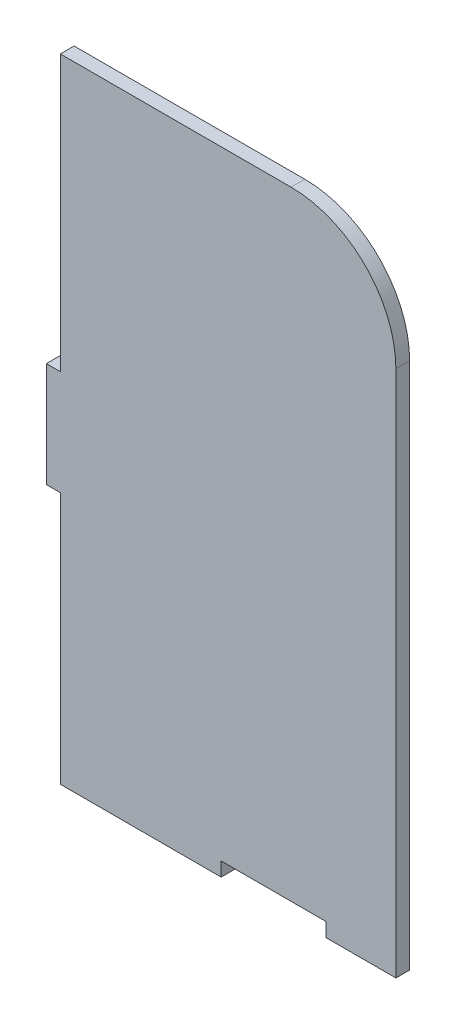
ISO-10303-21;
HEADER;
FILE_DESCRIPTION(('STEP AP214'),'2;1');
FILE_NAME('part.step','',(''),(''),'','','');
FILE_SCHEMA(('AUTOMOTIVE_DESIGN { 1 0 10303 214 1 1 1 1 }'));
ENDSEC;
DATA;
#1=APPLICATION_CONTEXT('core data for automotive mechanical design processes');
#2=APPLICATION_PROTOCOL_DEFINITION('international standard','automotive_design',2000,#1);
#3=PRODUCT_CONTEXT('',#1,'mechanical');
#4=PRODUCT('Part','Part','',(#3));
#5=PRODUCT_RELATED_PRODUCT_CATEGORY('part','',(#4));
#6=PRODUCT_DEFINITION_FORMATION('','',#4);
#7=PRODUCT_DEFINITION_CONTEXT('part definition',#1,'design');
#8=PRODUCT_DEFINITION('design','',#6,#7);
#9=PRODUCT_DEFINITION_SHAPE('','',#8);
#10=(LENGTH_UNIT() NAMED_UNIT(*) SI_UNIT(.MILLI.,.METRE.));
#11=(NAMED_UNIT(*) PLANE_ANGLE_UNIT() SI_UNIT($,.RADIAN.));
#12=(NAMED_UNIT(*) SI_UNIT($,.STERADIAN.) SOLID_ANGLE_UNIT());
#13=UNCERTAINTY_MEASURE_WITH_UNIT(LENGTH_MEASURE(1.E-05),#10,'distance_accuracy_value','');
#14=(GEOMETRIC_REPRESENTATION_CONTEXT(3) GLOBAL_UNCERTAINTY_ASSIGNED_CONTEXT((#13)) GLOBAL_UNIT_ASSIGNED_CONTEXT((#10,
#11,#12)) REPRESENTATION_CONTEXT('',''));
#15=CARTESIAN_POINT('',(0.,0.,0.));
#16=DIRECTION('',(0.,0.,1.));
#17=DIRECTION('',(1.,0.,0.));
#18=AXIS2_PLACEMENT_3D('',#15,#16,#17);
#19=CARTESIAN_POINT('',(215.829586762206,-10.1600000000001,-10.));
#20=DIRECTION('',(-1.,0.,0.));
#21=DIRECTION('',(0.,0.,1.));
#22=AXIS2_PLACEMENT_3D('',#19,#20,#21);
#23=PLANE('',#22);
#24=DIRECTION('',(0.,-1.,0.));
#25=VECTOR('',#24,1.);
#26=CARTESIAN_POINT('',(215.829586762206,-10.1600000000001,0.));
#27=LINE('',#26,#25);
#28=CARTESIAN_POINT('',(215.829586762206,-10.1600000000001,0.));
#29=VERTEX_POINT('',#28);
#30=CARTESIAN_POINT('',(215.829586762206,-210.16,0.));
#31=VERTEX_POINT('',#30);
#32=EDGE_CURVE('E163',#29,#31,#27,.T.);
#33=ORIENTED_EDGE('',*,*,#32,.F.);
#34=DIRECTION('',(0.,0.,1.));
#35=VECTOR('',#34,1.);
#36=CARTESIAN_POINT('',(215.829586762206,-10.1600000000001,-10.));
#37=LINE('',#36,#35);
#38=CARTESIAN_POINT('',(215.829586762206,-10.1600000000001,-10.));
#39=VERTEX_POINT('',#38);
#40=EDGE_CURVE('E11',#39,#29,#37,.T.);
#41=ORIENTED_EDGE('',*,*,#40,.F.);
#42=DIRECTION('',(0.,-1.,0.));
#43=VECTOR('',#42,1.);
#44=CARTESIAN_POINT('',(215.829586762206,-10.1600000000001,-10.));
#45=LINE('',#44,#43);
#46=CARTESIAN_POINT('',(215.829586762206,-210.16,-10.));
#47=VERTEX_POINT('',#46);
#48=EDGE_CURVE('E198',#39,#47,#45,.T.);
#49=ORIENTED_EDGE('',*,*,#48,.T.);
#50=DIRECTION('',(0.,0.,1.));
#51=VECTOR('',#50,1.);
#52=CARTESIAN_POINT('',(215.829586762206,-210.16,-10.));
#53=LINE('',#52,#51);
#54=EDGE_CURVE('E39',#47,#31,#53,.T.);
#55=ORIENTED_EDGE('',*,*,#54,.T.);
#56=EDGE_LOOP('',(#33,#41,#49,#55));
#57=FACE_BOUND('',#56,.T.);
#58=ADVANCED_FACE('F36',(#57),#23,.T.);
#59=CARTESIAN_POINT('',(215.829586762206,-10.1600000000001,-10.));
#60=DIRECTION('',(0.,1.,0.));
#61=DIRECTION('',(0.,0.,1.));
#62=AXIS2_PLACEMENT_3D('',#59,#60,#61);
#63=PLANE('',#62);
#64=DIRECTION('',(-1.,0.,0.));
#65=VECTOR('',#64,1.);
#66=CARTESIAN_POINT('',(215.829586762206,-10.1600000000001,0.));
#67=LINE('',#66,#65);
#68=CARTESIAN_POINT('',(383.521789204401,-10.1600000000001,0.));
#69=VERTEX_POINT('',#68);
#70=EDGE_CURVE('E196',#69,#29,#67,.T.);
#71=ORIENTED_EDGE('',*,*,#70,.F.);
#72=DIRECTION('',(0.,0.,1.));
#73=VECTOR('',#72,1.);
#74=CARTESIAN_POINT('',(383.521789204401,-10.1600000000001,-10.));
#75=LINE('',#74,#73);
#76=CARTESIAN_POINT('',(383.521789204401,-10.1600000000001,-10.));
#77=VERTEX_POINT('',#76);
#78=EDGE_CURVE('E45',#77,#69,#75,.T.);
#79=ORIENTED_EDGE('',*,*,#78,.F.);
#80=DIRECTION('',(-1.,0.,0.));
#81=VECTOR('',#80,1.);
#82=CARTESIAN_POINT('',(215.829586762206,-10.1600000000001,-10.));
#83=LINE('',#82,#81);
#84=EDGE_CURVE('E153',#77,#39,#83,.T.);
#85=ORIENTED_EDGE('',*,*,#84,.T.);
#86=ORIENTED_EDGE('',*,*,#40,.T.);
#87=EDGE_LOOP('',(#71,#79,#85,#86));
#88=FACE_BOUND('',#87,.T.);
#89=ADVANCED_FACE('F220',(#88),#63,.T.);
#90=CARTESIAN_POINT('',(383.521789204401,-86.3600000000001,-10.));
#91=DIRECTION('',(0.,0.,1.));
#92=DIRECTION('',(1.,0.,0.));
#93=AXIS2_PLACEMENT_3D('',#90,#91,#92);
#94=CYLINDRICAL_SURFACE('',#93,76.2);
#95=CARTESIAN_POINT('',(383.521789204401,-86.3600000000001,0.));
#96=DIRECTION('',(0.,0.,1.));
#97=DIRECTION('',(1.,0.,0.));
#98=AXIS2_PLACEMENT_3D('',#95,#96,#97);
#99=CIRCLE('',#98,76.2);
#100=CARTESIAN_POINT('',(459.721789204401,-86.3600000000001,0.));
#101=VERTEX_POINT('',#100);
#102=EDGE_CURVE('E140',#101,#69,#99,.T.);
#103=ORIENTED_EDGE('',*,*,#102,.F.);
#104=DIRECTION('',(0.,0.,1.));
#105=VECTOR('',#104,1.);
#106=CARTESIAN_POINT('',(459.721789204401,-86.3600000000001,-10.));
#107=LINE('',#106,#105);
#108=CARTESIAN_POINT('',(459.721789204401,-86.3600000000001,-10.));
#109=VERTEX_POINT('',#108);
#110=EDGE_CURVE('E135',#109,#101,#107,.T.);
#111=ORIENTED_EDGE('',*,*,#110,.F.);
#112=CARTESIAN_POINT('',(383.521789204401,-86.3600000000001,-10.));
#113=DIRECTION('',(0.,0.,1.));
#114=DIRECTION('',(1.,0.,0.));
#115=AXIS2_PLACEMENT_3D('',#112,#113,#114);
#116=CIRCLE('',#115,76.2);
#117=EDGE_CURVE('E138',#109,#77,#116,.T.);
#118=ORIENTED_EDGE('',*,*,#117,.T.);
#119=ORIENTED_EDGE('',*,*,#78,.T.);
#120=EDGE_LOOP('',(#103,#111,#118,#119));
#121=FACE_BOUND('',#120,.T.);
#122=ADVANCED_FACE('F137',(#121),#94,.T.);
#123=CARTESIAN_POINT('',(459.721789204401,-86.3600000000001,-10.));
#124=DIRECTION('',(1.,0.,0.));
#125=DIRECTION('',(0.,1.,0.));
#126=AXIS2_PLACEMENT_3D('',#123,#124,#125);
#127=PLANE('',#126);
#128=DIRECTION('',(0.,1.,0.));
#129=VECTOR('',#128,1.);
#130=CARTESIAN_POINT('',(459.721789204401,-86.3600000000001,0.));
#131=LINE('',#130,#129);
#132=CARTESIAN_POINT('',(459.721789204401,-469.9,0.));
#133=VERTEX_POINT('',#132);
#134=EDGE_CURVE('E193',#133,#101,#131,.T.);
#135=ORIENTED_EDGE('',*,*,#134,.F.);
#136=DIRECTION('',(0.,0.,1.));
#137=VECTOR('',#136,1.);
#138=CARTESIAN_POINT('',(459.721789204401,-469.9,-10.));
#139=LINE('',#138,#137);
#140=CARTESIAN_POINT('',(459.721789204401,-469.9,-10.));
#141=VERTEX_POINT('',#140);
#142=EDGE_CURVE('E145',#141,#133,#139,.T.);
#143=ORIENTED_EDGE('',*,*,#142,.F.);
#144=DIRECTION('',(0.,1.,0.));
#145=VECTOR('',#144,1.);
#146=CARTESIAN_POINT('',(459.721789204401,-86.3600000000001,-10.));
#147=LINE('',#146,#145);
#148=EDGE_CURVE('E151',#141,#109,#147,.T.);
#149=ORIENTED_EDGE('',*,*,#148,.T.);
#150=ORIENTED_EDGE('',*,*,#110,.T.);
#151=EDGE_LOOP('',(#135,#143,#149,#150));
#152=FACE_BOUND('',#151,.T.);
#153=ADVANCED_FACE('F155',(#152),#127,.T.);
#154=CARTESIAN_POINT('',(408.9217892044,-469.9,-10.));
#155=DIRECTION('',(0.,-1.,0.));
#156=DIRECTION('',(0.,0.,-1.));
#157=AXIS2_PLACEMENT_3D('',#154,#155,#156);
#158=PLANE('',#157);
#159=DIRECTION('',(1.,0.,0.));
#160=VECTOR('',#159,1.);
#161=CARTESIAN_POINT('',(408.9217892044,-469.9,0.));
#162=LINE('',#161,#160);
#163=CARTESIAN_POINT('',(408.9217892044,-469.9,0.));
#164=VERTEX_POINT('',#163);
#165=EDGE_CURVE('E190',#164,#133,#162,.T.);
#166=ORIENTED_EDGE('',*,*,#165,.F.);
#167=DIRECTION('',(0.,0.,1.));
#168=VECTOR('',#167,1.);
#169=CARTESIAN_POINT('',(408.9217892044,-469.9,-10.));
#170=LINE('',#169,#168);
#171=CARTESIAN_POINT('',(408.9217892044,-469.9,-10.));
#172=VERTEX_POINT('',#171);
#173=EDGE_CURVE('E202',#172,#164,#170,.T.);
#174=ORIENTED_EDGE('',*,*,#173,.F.);
#175=DIRECTION('',(1.,0.,0.));
#176=VECTOR('',#175,1.);
#177=CARTESIAN_POINT('',(408.9217892044,-469.9,-10.));
#178=LINE('',#177,#176);
#179=EDGE_CURVE('E156',#172,#141,#178,.T.);
#180=ORIENTED_EDGE('',*,*,#179,.T.);
#181=ORIENTED_EDGE('',*,*,#142,.T.);
#182=EDGE_LOOP('',(#166,#174,#180,#181));
#183=FACE_BOUND('',#182,.T.);
#184=ADVANCED_FACE('F233',(#183),#158,.T.);
#185=CARTESIAN_POINT('',(408.9217892044,-469.9,-10.));
#186=DIRECTION('',(-1.,0.,0.));
#187=DIRECTION('',(0.,0.,1.));
#188=AXIS2_PLACEMENT_3D('',#185,#186,#187);
#189=PLANE('',#188);
#190=DIRECTION('',(0.,-1.,0.));
#191=VECTOR('',#190,1.);
#192=CARTESIAN_POINT('',(408.9217892044,-469.9,0.));
#193=LINE('',#192,#191);
#194=CARTESIAN_POINT('',(408.9217892044,-459.739999999998,0.));
#195=VERTEX_POINT('',#194);
#196=EDGE_CURVE('E187',#195,#164,#193,.T.);
#197=ORIENTED_EDGE('',*,*,#196,.F.);
#198=DIRECTION('',(0.,0.,1.));
#199=VECTOR('',#198,1.);
#200=CARTESIAN_POINT('',(408.9217892044,-459.739999999998,-10.));
#201=LINE('',#200,#199);
#202=CARTESIAN_POINT('',(408.9217892044,-459.739999999998,-10.));
#203=VERTEX_POINT('',#202);
#204=EDGE_CURVE('E204',#203,#195,#201,.T.);
#205=ORIENTED_EDGE('',*,*,#204,.F.);
#206=DIRECTION('',(0.,-1.,0.));
#207=VECTOR('',#206,1.);
#208=CARTESIAN_POINT('',(408.9217892044,-469.9,-10.));
#209=LINE('',#208,#207);
#210=EDGE_CURVE('E158',#203,#172,#209,.T.);
#211=ORIENTED_EDGE('',*,*,#210,.T.);
#212=ORIENTED_EDGE('',*,*,#173,.T.);
#213=EDGE_LOOP('',(#197,#205,#211,#212));
#214=FACE_BOUND('',#213,.T.);
#215=ADVANCED_FACE('F236',(#214),#189,.T.);
#216=CARTESIAN_POINT('',(408.9217892044,-459.739999999998,-10.));
#217=DIRECTION('',(0.,-1.,0.));
#218=DIRECTION('',(0.,0.,-1.));
#219=AXIS2_PLACEMENT_3D('',#216,#217,#218);
#220=PLANE('',#219);
#221=DIRECTION('',(1.,0.,0.));
#222=VECTOR('',#221,1.);
#223=CARTESIAN_POINT('',(408.9217892044,-459.739999999998,0.));
#224=LINE('',#223,#222);
#225=CARTESIAN_POINT('',(332.7217892044,-459.739999999998,0.));
#226=VERTEX_POINT('',#225);
#227=EDGE_CURVE('E184',#226,#195,#224,.T.);
#228=ORIENTED_EDGE('',*,*,#227,.F.);
#229=DIRECTION('',(0.,0.,1.));
#230=VECTOR('',#229,1.);
#231=CARTESIAN_POINT('',(332.7217892044,-459.739999999998,-10.));
#232=LINE('',#231,#230);
#233=CARTESIAN_POINT('',(332.7217892044,-459.739999999998,-10.));
#234=VERTEX_POINT('',#233);
#235=EDGE_CURVE('E206',#234,#226,#232,.T.);
#236=ORIENTED_EDGE('',*,*,#235,.F.);
#237=DIRECTION('',(1.,0.,0.));
#238=VECTOR('',#237,1.);
#239=CARTESIAN_POINT('',(408.9217892044,-459.739999999998,-10.));
#240=LINE('',#239,#238);
#241=EDGE_CURVE('E406',#234,#203,#240,.T.);
#242=ORIENTED_EDGE('',*,*,#241,.T.);
#243=ORIENTED_EDGE('',*,*,#204,.T.);
#244=EDGE_LOOP('',(#228,#236,#242,#243));
#245=FACE_BOUND('',#244,.T.);
#246=ADVANCED_FACE('F240',(#245),#220,.T.);
#247=CARTESIAN_POINT('',(332.7217892044,-459.739999999998,-10.));
#248=DIRECTION('',(1.,0.,0.));
#249=DIRECTION('',(0.,0.,-1.));
#250=AXIS2_PLACEMENT_3D('',#247,#248,#249);
#251=PLANE('',#250);
#252=DIRECTION('',(0.,1.,0.));
#253=VECTOR('',#252,1.);
#254=CARTESIAN_POINT('',(332.7217892044,-459.739999999998,0.));
#255=LINE('',#254,#253);
#256=CARTESIAN_POINT('',(332.7217892044,-469.9,0.));
#257=VERTEX_POINT('',#256);
#258=EDGE_CURVE('E181',#257,#226,#255,.T.);
#259=ORIENTED_EDGE('',*,*,#258,.F.);
#260=DIRECTION('',(0.,0.,1.));
#261=VECTOR('',#260,1.);
#262=CARTESIAN_POINT('',(332.7217892044,-469.9,-10.));
#263=LINE('',#262,#261);
#264=CARTESIAN_POINT('',(332.7217892044,-469.9,-10.));
#265=VERTEX_POINT('',#264);
#266=EDGE_CURVE('E208',#265,#257,#263,.T.);
#267=ORIENTED_EDGE('',*,*,#266,.F.);
#268=DIRECTION('',(0.,1.,0.));
#269=VECTOR('',#268,1.);
#270=CARTESIAN_POINT('',(332.7217892044,-459.739999999998,-10.));
#271=LINE('',#270,#269);
#272=EDGE_CURVE('E402',#265,#234,#271,.T.);
#273=ORIENTED_EDGE('',*,*,#272,.T.);
#274=ORIENTED_EDGE('',*,*,#235,.T.);
#275=EDGE_LOOP('',(#259,#267,#273,#274));
#276=FACE_BOUND('',#275,.T.);
#277=ADVANCED_FACE('F244',(#276),#251,.T.);
#278=CARTESIAN_POINT('',(215.829586762206,-469.9,-10.));
#279=DIRECTION('',(0.,-1.,0.));
#280=DIRECTION('',(0.,0.,-1.));
#281=AXIS2_PLACEMENT_3D('',#278,#279,#280);
#282=PLANE('',#281);
#283=DIRECTION('',(1.,0.,0.));
#284=VECTOR('',#283,1.);
#285=CARTESIAN_POINT('',(215.829586762206,-469.9,0.));
#286=LINE('',#285,#284);
#287=CARTESIAN_POINT('',(215.829586762206,-469.9,0.));
#288=VERTEX_POINT('',#287);
#289=EDGE_CURVE('E178',#288,#257,#286,.T.);
#290=ORIENTED_EDGE('',*,*,#289,.F.);
#291=DIRECTION('',(0.,0.,1.));
#292=VECTOR('',#291,1.);
#293=CARTESIAN_POINT('',(215.829586762206,-469.9,-10.));
#294=LINE('',#293,#292);
#295=CARTESIAN_POINT('',(215.829586762206,-469.9,-10.));
#296=VERTEX_POINT('',#295);
#297=EDGE_CURVE('E210',#296,#288,#294,.T.);
#298=ORIENTED_EDGE('',*,*,#297,.F.);
#299=DIRECTION('',(1.,0.,0.));
#300=VECTOR('',#299,1.);
#301=CARTESIAN_POINT('',(215.829586762206,-469.9,-10.));
#302=LINE('',#301,#300);
#303=EDGE_CURVE('E413',#296,#265,#302,.T.);
#304=ORIENTED_EDGE('',*,*,#303,.T.);
#305=ORIENTED_EDGE('',*,*,#266,.T.);
#306=EDGE_LOOP('',(#290,#298,#304,#305));
#307=FACE_BOUND('',#306,.T.);
#308=ADVANCED_FACE('F248',(#307),#282,.T.);
#309=CARTESIAN_POINT('',(215.829586762206,-286.36,-10.));
#310=DIRECTION('',(-1.,0.,0.));
#311=DIRECTION('',(0.,-1.,0.));
#312=AXIS2_PLACEMENT_3D('',#309,#310,#311);
#313=PLANE('',#312);
#314=DIRECTION('',(0.,-1.,0.));
#315=VECTOR('',#314,1.);
#316=CARTESIAN_POINT('',(215.829586762206,-286.36,0.));
#317=LINE('',#316,#315);
#318=CARTESIAN_POINT('',(215.829586762206,-286.36,0.));
#319=VERTEX_POINT('',#318);
#320=EDGE_CURVE('E175',#319,#288,#317,.T.);
#321=ORIENTED_EDGE('',*,*,#320,.F.);
#322=DIRECTION('',(0.,0.,1.));
#323=VECTOR('',#322,1.);
#324=CARTESIAN_POINT('',(215.829586762206,-286.36,-10.));
#325=LINE('',#324,#323);
#326=CARTESIAN_POINT('',(215.829586762206,-286.36,-10.));
#327=VERTEX_POINT('',#326);
#328=EDGE_CURVE('E212',#327,#319,#325,.T.);
#329=ORIENTED_EDGE('',*,*,#328,.F.);
#330=DIRECTION('',(0.,-1.,0.));
#331=VECTOR('',#330,1.);
#332=CARTESIAN_POINT('',(215.829586762206,-286.36,-10.));
#333=LINE('',#332,#331);
#334=EDGE_CURVE('E395',#327,#296,#333,.T.);
#335=ORIENTED_EDGE('',*,*,#334,.T.);
#336=ORIENTED_EDGE('',*,*,#297,.T.);
#337=EDGE_LOOP('',(#321,#329,#335,#336));
#338=FACE_BOUND('',#337,.T.);
#339=ADVANCED_FACE('F252',(#338),#313,.T.);
#340=CARTESIAN_POINT('',(205.663096360818,-286.36,-10.));
#341=DIRECTION('',(0.,-1.,0.));
#342=DIRECTION('',(1.,0.,0.));
#343=AXIS2_PLACEMENT_3D('',#340,#341,#342);
#344=PLANE('',#343);
#345=DIRECTION('',(1.,0.,0.));
#346=VECTOR('',#345,1.);
#347=CARTESIAN_POINT('',(205.663096360818,-286.36,0.));
#348=LINE('',#347,#346);
#349=CARTESIAN_POINT('',(205.663096360818,-286.36,0.));
#350=VERTEX_POINT('',#349);
#351=EDGE_CURVE('E172',#350,#319,#348,.T.);
#352=ORIENTED_EDGE('',*,*,#351,.F.);
#353=DIRECTION('',(0.,0.,1.));
#354=VECTOR('',#353,1.);
#355=CARTESIAN_POINT('',(205.663096360818,-286.36,-10.));
#356=LINE('',#355,#354);
#357=CARTESIAN_POINT('',(205.663096360818,-286.36,-10.));
#358=VERTEX_POINT('',#357);
#359=EDGE_CURVE('E214',#358,#350,#356,.T.);
#360=ORIENTED_EDGE('',*,*,#359,.F.);
#361=DIRECTION('',(1.,0.,0.));
#362=VECTOR('',#361,1.);
#363=CARTESIAN_POINT('',(205.663096360818,-286.36,-10.));
#364=LINE('',#363,#362);
#365=EDGE_CURVE('E391',#358,#327,#364,.T.);
#366=ORIENTED_EDGE('',*,*,#365,.T.);
#367=ORIENTED_EDGE('',*,*,#328,.T.);
#368=EDGE_LOOP('',(#352,#360,#366,#367));
#369=FACE_BOUND('',#368,.T.);
#370=ADVANCED_FACE('F256',(#369),#344,.T.);
#371=CARTESIAN_POINT('',(205.663096360818,-210.16,-10.));
#372=DIRECTION('',(-1.,0.,0.));
#373=DIRECTION('',(0.,-1.,0.));
#374=AXIS2_PLACEMENT_3D('',#371,#372,#373);
#375=PLANE('',#374);
#376=DIRECTION('',(0.,-1.,0.));
#377=VECTOR('',#376,1.);
#378=CARTESIAN_POINT('',(205.663096360818,-210.16,0.));
#379=LINE('',#378,#377);
#380=CARTESIAN_POINT('',(205.663096360818,-210.16,0.));
#381=VERTEX_POINT('',#380);
#382=EDGE_CURVE('E169',#381,#350,#379,.T.);
#383=ORIENTED_EDGE('',*,*,#382,.F.);
#384=DIRECTION('',(0.,0.,1.));
#385=VECTOR('',#384,1.);
#386=CARTESIAN_POINT('',(205.663096360818,-210.16,-10.));
#387=LINE('',#386,#385);
#388=CARTESIAN_POINT('',(205.663096360818,-210.16,-10.));
#389=VERTEX_POINT('',#388);
#390=EDGE_CURVE('E215',#389,#381,#387,.T.);
#391=ORIENTED_EDGE('',*,*,#390,.F.);
#392=DIRECTION('',(0.,-1.,0.));
#393=VECTOR('',#392,1.);
#394=CARTESIAN_POINT('',(205.663096360818,-210.16,-10.));
#395=LINE('',#394,#393);
#396=EDGE_CURVE('E417',#389,#358,#395,.T.);
#397=ORIENTED_EDGE('',*,*,#396,.T.);
#398=ORIENTED_EDGE('',*,*,#359,.T.);
#399=EDGE_LOOP('',(#383,#391,#397,#398));
#400=FACE_BOUND('',#399,.T.);
#401=ADVANCED_FACE('F260',(#400),#375,.T.);
#402=CARTESIAN_POINT('',(215.829586762206,-210.16,-10.));
#403=DIRECTION('',(0.,1.,0.));
#404=DIRECTION('',(0.,0.,1.));
#405=AXIS2_PLACEMENT_3D('',#402,#403,#404);
#406=PLANE('',#405);
#407=DIRECTION('',(-1.,0.,0.));
#408=VECTOR('',#407,1.);
#409=CARTESIAN_POINT('',(215.829586762206,-210.16,0.));
#410=LINE('',#409,#408);
#411=EDGE_CURVE('E166',#31,#381,#410,.T.);
#412=ORIENTED_EDGE('',*,*,#411,.F.);
#413=ORIENTED_EDGE('',*,*,#54,.F.);
#414=DIRECTION('',(-1.,0.,0.));
#415=VECTOR('',#414,1.);
#416=CARTESIAN_POINT('',(215.829586762206,-210.16,-10.));
#417=LINE('',#416,#415);
#418=EDGE_CURVE('E419',#47,#389,#417,.T.);
#419=ORIENTED_EDGE('',*,*,#418,.T.);
#420=ORIENTED_EDGE('',*,*,#390,.T.);
#421=EDGE_LOOP('',(#412,#413,#419,#420));
#422=FACE_BOUND('',#421,.T.);
#423=ADVANCED_FACE('F217',(#422),#406,.T.);
#424=CARTESIAN_POINT('',(383.521789204401,-86.3600000000001,-10.));
#425=DIRECTION('',(0.,0.,1.));
#426=DIRECTION('',(1.,0.,0.));
#427=AXIS2_PLACEMENT_3D('',#424,#425,#426);
#428=PLANE('',#427);
#429=ORIENTED_EDGE('',*,*,#48,.F.);
#430=ORIENTED_EDGE('',*,*,#84,.F.);
#431=ORIENTED_EDGE('',*,*,#117,.F.);
#432=ORIENTED_EDGE('',*,*,#148,.F.);
#433=ORIENTED_EDGE('',*,*,#179,.F.);
#434=ORIENTED_EDGE('',*,*,#210,.F.);
#435=ORIENTED_EDGE('',*,*,#241,.F.);
#436=ORIENTED_EDGE('',*,*,#272,.F.);
#437=ORIENTED_EDGE('',*,*,#303,.F.);
#438=ORIENTED_EDGE('',*,*,#334,.F.);
#439=ORIENTED_EDGE('',*,*,#365,.F.);
#440=ORIENTED_EDGE('',*,*,#396,.F.);
#441=ORIENTED_EDGE('',*,*,#418,.F.);
#442=EDGE_LOOP('',(#429,#430,#431,#432,#433,#434,#435,#436,#437,#438,#439,#440,#441));
#443=FACE_BOUND('',#442,.T.);
#444=ADVANCED_FACE('F149',(#443),#428,.F.);
#445=CARTESIAN_POINT('',(383.521789204401,-86.3600000000001,0.));
#446=DIRECTION('',(0.,0.,1.));
#447=DIRECTION('',(1.,0.,0.));
#448=AXIS2_PLACEMENT_3D('',#445,#446,#447);
#449=PLANE('',#448);
#450=ORIENTED_EDGE('',*,*,#32,.T.);
#451=ORIENTED_EDGE('',*,*,#411,.T.);
#452=ORIENTED_EDGE('',*,*,#382,.T.);
#453=ORIENTED_EDGE('',*,*,#351,.T.);
#454=ORIENTED_EDGE('',*,*,#320,.T.);
#455=ORIENTED_EDGE('',*,*,#289,.T.);
#456=ORIENTED_EDGE('',*,*,#258,.T.);
#457=ORIENTED_EDGE('',*,*,#227,.T.);
#458=ORIENTED_EDGE('',*,*,#196,.T.);
#459=ORIENTED_EDGE('',*,*,#165,.T.);
#460=ORIENTED_EDGE('',*,*,#134,.T.);
#461=ORIENTED_EDGE('',*,*,#102,.T.);
#462=ORIENTED_EDGE('',*,*,#70,.T.);
#463=EDGE_LOOP('',(#450,#451,#452,#453,#454,#455,#456,#457,#458,#459,#460,#461,#462));
#464=FACE_BOUND('',#463,.T.);
#465=ADVANCED_FACE('F219',(#464),#449,.T.);
#466=CLOSED_SHELL('',(#58,#89,#122,#153,#184,#215,#246,#277,#308,#339,#370,#401,#423,#444,#465));
#467=MANIFOLD_SOLID_BREP('B2',#466);
#468=ADVANCED_BREP_SHAPE_REPRESENTATION('',(#18,#467),#14);
#469=SHAPE_DEFINITION_REPRESENTATION(#9,#468);
ENDSEC;
END-ISO-10303-21;
